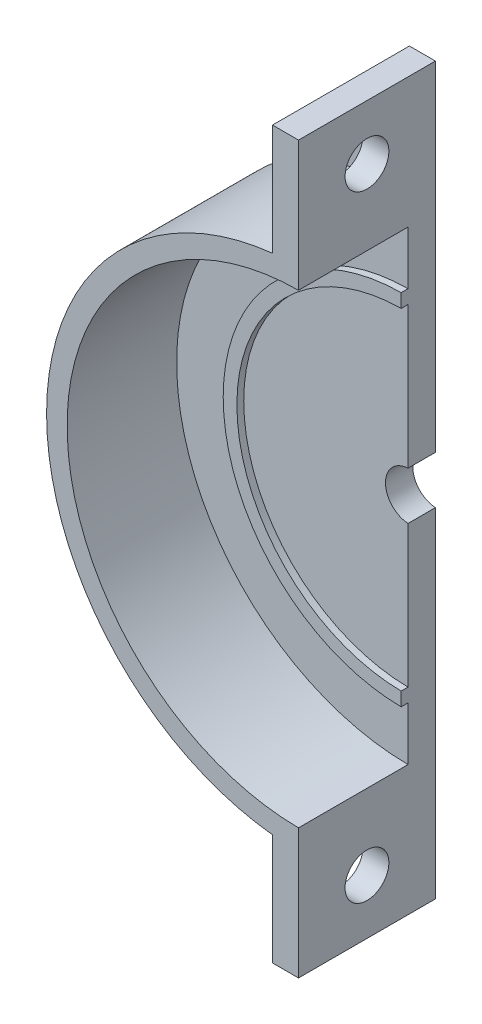
ISO-10303-21;
HEADER;
FILE_DESCRIPTION(('STEP AP214'),'2;1');
FILE_NAME('part.step','',(''),(''),'','','');
FILE_SCHEMA(('AUTOMOTIVE_DESIGN { 1 0 10303 214 1 1 1 1 }'));
ENDSEC;
DATA;
#1=APPLICATION_CONTEXT('core data for automotive mechanical design processes');
#2=APPLICATION_PROTOCOL_DEFINITION('international standard','automotive_design',2000,#1);
#3=PRODUCT_CONTEXT('',#1,'mechanical');
#4=PRODUCT('Part','Part','',(#3));
#5=PRODUCT_RELATED_PRODUCT_CATEGORY('part','',(#4));
#6=PRODUCT_DEFINITION_FORMATION('','',#4);
#7=PRODUCT_DEFINITION_CONTEXT('part definition',#1,'design');
#8=PRODUCT_DEFINITION('design','',#6,#7);
#9=PRODUCT_DEFINITION_SHAPE('','',#8);
#10=(LENGTH_UNIT() NAMED_UNIT(*) SI_UNIT(.MILLI.,.METRE.));
#11=(NAMED_UNIT(*) PLANE_ANGLE_UNIT() SI_UNIT($,.RADIAN.));
#12=(NAMED_UNIT(*) SI_UNIT($,.STERADIAN.) SOLID_ANGLE_UNIT());
#13=UNCERTAINTY_MEASURE_WITH_UNIT(LENGTH_MEASURE(1.E-05),#10,'distance_accuracy_value','');
#14=(GEOMETRIC_REPRESENTATION_CONTEXT(3) GLOBAL_UNCERTAINTY_ASSIGNED_CONTEXT((#13)) GLOBAL_UNIT_ASSIGNED_CONTEXT((#10,
#11,#12)) REPRESENTATION_CONTEXT('',''));
#15=CARTESIAN_POINT('',(0.,0.,0.));
#16=DIRECTION('',(0.,0.,1.));
#17=DIRECTION('',(1.,0.,0.));
#18=AXIS2_PLACEMENT_3D('',#15,#16,#17);
#19=CARTESIAN_POINT('',(0.,0.,2.));
#20=DIRECTION('',(0.,0.,1.));
#21=DIRECTION('',(1.,0.,0.));
#22=AXIS2_PLACEMENT_3D('',#19,#20,#21);
#23=PLANE('',#22);
#24=DIRECTION('',(0.,1.,0.));
#25=VECTOR('',#24,1.);
#26=CARTESIAN_POINT('',(-0.0999999999999977,-1.65,2.));
#27=LINE('',#26,#25);
#28=CARTESIAN_POINT('',(-0.0999999999999952,-16.9997058798086,2.));
#29=VERTEX_POINT('',#28);
#30=CARTESIAN_POINT('',(-0.0999999999999959,-13.0996183150503,2.));
#31=VERTEX_POINT('',#30);
#32=EDGE_CURVE('E63',#29,#31,#27,.T.);
#33=ORIENTED_EDGE('',*,*,#32,.T.);
#34=CARTESIAN_POINT('',(0.,0.,2.));
#35=DIRECTION('',(0.,0.,1.));
#36=DIRECTION('',(1.,0.,0.));
#37=AXIS2_PLACEMENT_3D('',#34,#35,#36);
#38=CIRCLE('',#37,13.1);
#39=CARTESIAN_POINT('',(-0.0999999999999959,13.0996183150503,2.));
#40=VERTEX_POINT('',#39);
#41=EDGE_CURVE('E181',#40,#31,#38,.T.);
#42=ORIENTED_EDGE('',*,*,#41,.F.);
#43=DIRECTION('',(0.,1.,0.));
#44=VECTOR('',#43,1.);
#45=CARTESIAN_POINT('',(-0.0999999999999952,17.,2.));
#46=LINE('',#45,#44);
#47=CARTESIAN_POINT('',(-0.0999999999999952,16.9997058798086,2.));
#48=VERTEX_POINT('',#47);
#49=EDGE_CURVE('E285',#40,#48,#46,.T.);
#50=ORIENTED_EDGE('',*,*,#49,.T.);
#51=CARTESIAN_POINT('',(0.,0.,2.));
#52=DIRECTION('',(0.,0.,1.));
#53=DIRECTION('',(1.,0.,0.));
#54=AXIS2_PLACEMENT_3D('',#51,#52,#53);
#55=CIRCLE('',#54,17.);
#56=EDGE_CURVE('E258',#48,#29,#55,.T.);
#57=ORIENTED_EDGE('',*,*,#56,.T.);
#58=EDGE_LOOP('',(#33,#42,#50,#57));
#59=FACE_BOUND('',#58,.T.);
#60=ADVANCED_FACE('F38',(#59),#23,.T.);
#61=CARTESIAN_POINT('',(-0.0999999999999977,1.74714052096562,2.));
#62=VERTEX_POINT('',#61);
#63=CARTESIAN_POINT('',(-0.099999999999996,12.0995867698033,2.));
#64=VERTEX_POINT('',#63);
#65=EDGE_CURVE('E261',#62,#64,#46,.T.);
#66=ORIENTED_EDGE('',*,*,#65,.T.);
#67=CARTESIAN_POINT('',(0.,0.,2.));
#68=DIRECTION('',(0.,0.,-1.));
#69=DIRECTION('',(1.,0.,0.));
#70=AXIS2_PLACEMENT_3D('',#67,#68,#69);
#71=CIRCLE('',#70,12.1);
#72=CARTESIAN_POINT('',(-0.099999999999996,-12.0995867698033,2.));
#73=VERTEX_POINT('',#72);
#74=EDGE_CURVE('E55',#73,#64,#71,.T.);
#75=ORIENTED_EDGE('',*,*,#74,.F.);
#76=CARTESIAN_POINT('',(-0.0999999999999977,-1.74714052096562,2.));
#77=VERTEX_POINT('',#76);
#78=EDGE_CURVE('E260',#73,#77,#27,.T.);
#79=ORIENTED_EDGE('',*,*,#78,.T.);
#80=CARTESIAN_POINT('',(0.,0.,2.));
#81=DIRECTION('',(0.,0.,1.));
#82=DIRECTION('',(1.,0.,0.));
#83=AXIS2_PLACEMENT_3D('',#80,#81,#82);
#84=CIRCLE('',#83,1.75);
#85=EDGE_CURVE('E275',#77,#62,#84,.F.);
#86=ORIENTED_EDGE('',*,*,#85,.T.);
#87=EDGE_LOOP('',(#66,#75,#79,#86));
#88=FACE_BOUND('',#87,.T.);
#89=ADVANCED_FACE('F311',(#88),#23,.T.);
#90=CARTESIAN_POINT('',(0.,0.,10.));
#91=DIRECTION('',(0.,0.,-1.));
#92=DIRECTION('',(-1.,0.,0.));
#93=AXIS2_PLACEMENT_3D('',#90,#91,#92);
#94=CYLINDRICAL_SURFACE('',#93,18.5);
#95=DIRECTION('',(0.,0.,-1.));
#96=VECTOR('',#95,1.);
#97=CARTESIAN_POINT('',(-6.88958672316867,17.1692630821459,1.));
#98=LINE('',#97,#96);
#99=CARTESIAN_POINT('',(-6.88958672316867,17.1692630821459,1.));
#100=VERTEX_POINT('',#99);
#101=CARTESIAN_POINT('',(-6.88958672316867,17.1692630821459,0.));
#102=VERTEX_POINT('',#101);
#103=EDGE_CURVE('E193',#100,#102,#98,.T.);
#104=ORIENTED_EDGE('',*,*,#103,.T.);
#105=CARTESIAN_POINT('',(0.,0.,0.));
#106=DIRECTION('',(0.,0.,1.));
#107=DIRECTION('',(-1.,0.,0.));
#108=AXIS2_PLACEMENT_3D('',#105,#106,#107);
#109=CIRCLE('',#108,18.5);
#110=CARTESIAN_POINT('',(-6.88958672316868,-17.1692630821459,0.));
#111=VERTEX_POINT('',#110);
#112=EDGE_CURVE('E250',#102,#111,#109,.T.);
#113=ORIENTED_EDGE('',*,*,#112,.T.);
#114=DIRECTION('',(0.,0.,-1.));
#115=VECTOR('',#114,1.);
#116=CARTESIAN_POINT('',(-6.88958672316867,-17.1692630821459,1.));
#117=LINE('',#116,#115);
#118=CARTESIAN_POINT('',(-6.88958672316868,-17.1692630821459,0.999999999999999));
#119=VERTEX_POINT('',#118);
#120=EDGE_CURVE('E224',#119,#111,#117,.T.);
#121=ORIENTED_EDGE('',*,*,#120,.F.);
#122=CARTESIAN_POINT('',(0.,0.,0.999999999999999));
#123=DIRECTION('',(0.,0.,1.));
#124=DIRECTION('',(1.,0.,0.));
#125=AXIS2_PLACEMENT_3D('',#122,#123,#124);
#126=CIRCLE('',#125,18.5);
#127=CARTESIAN_POINT('',(-2.,-18.3915741577495,0.999999999999999));
#128=VERTEX_POINT('',#127);
#129=EDGE_CURVE('E229',#119,#128,#126,.T.);
#130=ORIENTED_EDGE('',*,*,#129,.T.);
#131=DIRECTION('',(0.,0.,-1.));
#132=VECTOR('',#131,1.);
#133=CARTESIAN_POINT('',(-2.,-18.3915741577495,10.));
#134=LINE('',#133,#132);
#135=CARTESIAN_POINT('',(-2.,-18.3915741577495,10.));
#136=VERTEX_POINT('',#135);
#137=EDGE_CURVE('E247',#128,#136,#134,.F.);
#138=ORIENTED_EDGE('',*,*,#137,.T.);
#139=CARTESIAN_POINT('',(0.,0.,10.));
#140=DIRECTION('',(0.,0.,1.));
#141=DIRECTION('',(-1.,0.,0.));
#142=AXIS2_PLACEMENT_3D('',#139,#140,#141);
#143=CIRCLE('',#142,18.5);
#144=CARTESIAN_POINT('',(-2.,18.3915741577495,10.));
#145=VERTEX_POINT('',#144);
#146=EDGE_CURVE('E251',#145,#136,#143,.T.);
#147=ORIENTED_EDGE('',*,*,#146,.F.);
#148=DIRECTION('',(0.,0.,-1.));
#149=VECTOR('',#148,1.);
#150=CARTESIAN_POINT('',(-2.,18.3915741577495,10.));
#151=LINE('',#150,#149);
#152=CARTESIAN_POINT('',(-2.,18.3915741577495,1.));
#153=VERTEX_POINT('',#152);
#154=EDGE_CURVE('E214',#153,#145,#151,.F.);
#155=ORIENTED_EDGE('',*,*,#154,.F.);
#156=CARTESIAN_POINT('',(0.,0.,0.999999999999999));
#157=DIRECTION('',(0.,0.,1.));
#158=DIRECTION('',(1.,0.,0.));
#159=AXIS2_PLACEMENT_3D('',#156,#157,#158);
#160=CIRCLE('',#159,18.5);
#161=EDGE_CURVE('E197',#153,#100,#160,.T.);
#162=ORIENTED_EDGE('',*,*,#161,.T.);
#163=EDGE_LOOP('',(#104,#113,#121,#130,#138,#147,#155,#162));
#164=FACE_BOUND('',#163,.T.);
#165=ADVANCED_FACE('F317',(#164),#94,.T.);
#166=CARTESIAN_POINT('',(0.,0.,2.));
#167=DIRECTION('',(0.,0.,-1.));
#168=DIRECTION('',(-1.,0.,0.));
#169=AXIS2_PLACEMENT_3D('',#166,#167,#168);
#170=CYLINDRICAL_SURFACE('',#169,1.75);
#171=CARTESIAN_POINT('',(0.,0.,0.));
#172=DIRECTION('',(0.,0.,1.));
#173=DIRECTION('',(1.,0.,0.));
#174=AXIS2_PLACEMENT_3D('',#171,#172,#173);
#175=CIRCLE('',#174,1.75);
#176=CARTESIAN_POINT('',(-0.0999999999999977,-1.74714052096562,0.));
#177=VERTEX_POINT('',#176);
#178=CARTESIAN_POINT('',(-0.0999999999999977,1.74714052096562,0.));
#179=VERTEX_POINT('',#178);
#180=EDGE_CURVE('E268',#177,#179,#175,.F.);
#181=ORIENTED_EDGE('',*,*,#180,.T.);
#182=DIRECTION('',(0.,0.,-1.));
#183=VECTOR('',#182,1.);
#184=CARTESIAN_POINT('',(-0.0999999999999977,1.74714052096562,2.));
#185=LINE('',#184,#183);
#186=EDGE_CURVE('E12',#62,#179,#185,.T.);
#187=ORIENTED_EDGE('',*,*,#186,.F.);
#188=ORIENTED_EDGE('',*,*,#85,.F.);
#189=DIRECTION('',(0.,0.,-1.));
#190=VECTOR('',#189,1.);
#191=CARTESIAN_POINT('',(-0.0999999999999977,-1.74714052096562,2.));
#192=LINE('',#191,#190);
#193=EDGE_CURVE('E47',#77,#177,#192,.T.);
#194=ORIENTED_EDGE('',*,*,#193,.T.);
#195=EDGE_LOOP('',(#181,#187,#188,#194));
#196=FACE_BOUND('',#195,.T.);
#197=ADVANCED_FACE('F307',(#196),#170,.F.);
#198=CARTESIAN_POINT('',(-0.0999999999999952,17.,2.));
#199=DIRECTION('',(-1.,0.,0.));
#200=DIRECTION('',(0.,-1.,0.));
#201=AXIS2_PLACEMENT_3D('',#198,#199,#200);
#202=PLANE('',#201);
#203=CARTESIAN_POINT('',(-0.0999999999999942,22.5,5.));
#204=DIRECTION('',(-1.,0.,0.));
#205=DIRECTION('',(0.,-1.,0.));
#206=AXIS2_PLACEMENT_3D('',#203,#204,#205);
#207=CIRCLE('',#206,1.6);
#208=CARTESIAN_POINT('',(-0.0999999999999945,20.9,5.));
#209=VERTEX_POINT('',#208);
#210=EDGE_CURVE('E42',#209,#209,#207,.T.);
#211=ORIENTED_EDGE('',*,*,#210,.T.);
#212=EDGE_LOOP('',(#211));
#213=FACE_BOUND('',#212,.T.);
#214=DIRECTION('',(0.,1.,0.));
#215=VECTOR('',#214,1.);
#216=CARTESIAN_POINT('',(-0.0999999999999952,17.,0.));
#217=LINE('',#216,#215);
#218=CARTESIAN_POINT('',(-0.0999999999999937,26.5,0.));
#219=VERTEX_POINT('',#218);
#220=EDGE_CURVE('E271',#179,#219,#217,.T.);
#221=ORIENTED_EDGE('',*,*,#220,.T.);
#222=DIRECTION('',(0.,0.,1.));
#223=VECTOR('',#222,1.);
#224=CARTESIAN_POINT('',(-0.0999999999999937,26.5,2.));
#225=LINE('',#224,#223);
#226=CARTESIAN_POINT('',(-0.0999999999999937,26.5,10.));
#227=VERTEX_POINT('',#226);
#228=EDGE_CURVE('E203',#219,#227,#225,.T.);
#229=ORIENTED_EDGE('',*,*,#228,.T.);
#230=DIRECTION('',(0.,1.,0.));
#231=VECTOR('',#230,1.);
#232=CARTESIAN_POINT('',(-0.099999999999998,0.,10.));
#233=LINE('',#232,#231);
#234=CARTESIAN_POINT('',(-0.0999999999999952,16.9997058798086,10.));
#235=VERTEX_POINT('',#234);
#236=EDGE_CURVE('E256',#235,#227,#233,.T.);
#237=ORIENTED_EDGE('',*,*,#236,.F.);
#238=DIRECTION('',(0.,0.,-1.));
#239=VECTOR('',#238,1.);
#240=CARTESIAN_POINT('',(-0.0999999999999952,16.9997058798086,10.));
#241=LINE('',#240,#239);
#242=EDGE_CURVE('E281',#235,#48,#241,.T.);
#243=ORIENTED_EDGE('',*,*,#242,.T.);
#244=ORIENTED_EDGE('',*,*,#49,.F.);
#245=DIRECTION('',(0.,0.,-1.));
#246=VECTOR('',#245,1.);
#247=CARTESIAN_POINT('',(-0.0999999999999959,13.0996183150503,2.5));
#248=LINE('',#247,#246);
#249=CARTESIAN_POINT('',(-0.0999999999999959,13.0996183150503,2.5));
#250=VERTEX_POINT('',#249);
#251=EDGE_CURVE('E378',#250,#40,#248,.T.);
#252=ORIENTED_EDGE('',*,*,#251,.F.);
#253=DIRECTION('',(0.,1.,0.));
#254=VECTOR('',#253,1.);
#255=CARTESIAN_POINT('',(-0.0999999999999959,13.0996183150503,2.5));
#256=LINE('',#255,#254);
#257=CARTESIAN_POINT('',(-0.0999999999999959,12.0995867698033,2.5));
#258=VERTEX_POINT('',#257);
#259=EDGE_CURVE('E175',#258,#250,#256,.T.);
#260=ORIENTED_EDGE('',*,*,#259,.F.);
#261=DIRECTION('',(0.,0.,-1.));
#262=VECTOR('',#261,1.);
#263=CARTESIAN_POINT('',(-0.0999999999999959,12.0995867698033,2.5));
#264=LINE('',#263,#262);
#265=EDGE_CURVE('E186',#258,#64,#264,.T.);
#266=ORIENTED_EDGE('',*,*,#265,.T.);
#267=ORIENTED_EDGE('',*,*,#65,.F.);
#268=ORIENTED_EDGE('',*,*,#186,.T.);
#269=EDGE_LOOP('',(#221,#229,#237,#243,#244,#252,#260,#266,#267,#268));
#270=FACE_BOUND('',#269,.T.);
#271=ADVANCED_FACE('F40',(#213,#270),#202,.F.);
#272=CARTESIAN_POINT('',(-0.0999999999999977,-1.65,2.));
#273=DIRECTION('',(-1.,0.,0.));
#274=DIRECTION('',(0.,-1.,0.));
#275=AXIS2_PLACEMENT_3D('',#272,#273,#274);
#276=PLANE('',#275);
#277=CARTESIAN_POINT('',(-0.0999999999999942,-22.5,5.));
#278=DIRECTION('',(-1.,0.,0.));
#279=DIRECTION('',(0.,-1.,0.));
#280=AXIS2_PLACEMENT_3D('',#277,#278,#279);
#281=CIRCLE('',#280,1.6);
#282=CARTESIAN_POINT('',(-0.0999999999999939,-24.1,5.));
#283=VERTEX_POINT('',#282);
#284=EDGE_CURVE('E231',#283,#283,#281,.F.);
#285=ORIENTED_EDGE('',*,*,#284,.F.);
#286=EDGE_LOOP('',(#285));
#287=FACE_BOUND('',#286,.T.);
#288=DIRECTION('',(0.,1.,0.));
#289=VECTOR('',#288,1.);
#290=CARTESIAN_POINT('',(-0.0999999999999977,-1.65,0.));
#291=LINE('',#290,#289);
#292=CARTESIAN_POINT('',(-0.0999999999999937,-26.5,0.));
#293=VERTEX_POINT('',#292);
#294=EDGE_CURVE('E273',#293,#177,#291,.T.);
#295=ORIENTED_EDGE('',*,*,#294,.T.);
#296=ORIENTED_EDGE('',*,*,#193,.F.);
#297=ORIENTED_EDGE('',*,*,#78,.F.);
#298=DIRECTION('',(0.,0.,-1.));
#299=VECTOR('',#298,1.);
#300=CARTESIAN_POINT('',(-0.0999999999999996,-12.0995867698033,2.5));
#301=LINE('',#300,#299);
#302=CARTESIAN_POINT('',(-0.0999999999999996,-12.0995867698033,2.5));
#303=VERTEX_POINT('',#302);
#304=EDGE_CURVE('E166',#303,#73,#301,.T.);
#305=ORIENTED_EDGE('',*,*,#304,.F.);
#306=DIRECTION('',(0.,1.,0.));
#307=VECTOR('',#306,1.);
#308=CARTESIAN_POINT('',(-0.0999999999999959,-12.0995867698033,2.5));
#309=LINE('',#308,#307);
#310=CARTESIAN_POINT('',(-0.0999999999999959,-13.0996183150503,2.5));
#311=VERTEX_POINT('',#310);
#312=EDGE_CURVE('E159',#311,#303,#309,.T.);
#313=ORIENTED_EDGE('',*,*,#312,.F.);
#314=DIRECTION('',(0.,0.,-1.));
#315=VECTOR('',#314,1.);
#316=CARTESIAN_POINT('',(-0.0999999999999959,-13.0996183150503,2.5));
#317=LINE('',#316,#315);
#318=EDGE_CURVE('E163',#311,#31,#317,.T.);
#319=ORIENTED_EDGE('',*,*,#318,.T.);
#320=ORIENTED_EDGE('',*,*,#32,.F.);
#321=DIRECTION('',(0.,0.,-1.));
#322=VECTOR('',#321,1.);
#323=CARTESIAN_POINT('',(-0.0999999999999952,-16.9997058798086,10.));
#324=LINE('',#323,#322);
#325=CARTESIAN_POINT('',(-0.0999999999999952,-16.9997058798086,10.));
#326=VERTEX_POINT('',#325);
#327=EDGE_CURVE('E272',#326,#29,#324,.T.);
#328=ORIENTED_EDGE('',*,*,#327,.F.);
#329=DIRECTION('',(0.,1.,0.));
#330=VECTOR('',#329,1.);
#331=CARTESIAN_POINT('',(-0.099999999999998,0.,10.));
#332=LINE('',#331,#330);
#333=CARTESIAN_POINT('',(-0.0999999999999937,-26.5,10.));
#334=VERTEX_POINT('',#333);
#335=EDGE_CURVE('E253',#334,#326,#332,.T.);
#336=ORIENTED_EDGE('',*,*,#335,.F.);
#337=DIRECTION('',(0.,0.,1.));
#338=VECTOR('',#337,1.);
#339=CARTESIAN_POINT('',(-0.0999999999999937,-26.5,2.));
#340=LINE('',#339,#338);
#341=EDGE_CURVE('E246',#293,#334,#340,.T.);
#342=ORIENTED_EDGE('',*,*,#341,.F.);
#343=EDGE_LOOP('',(#295,#296,#297,#305,#313,#319,#320,#328,#336,#342));
#344=FACE_BOUND('',#343,.T.);
#345=ADVANCED_FACE('F161',(#287,#344),#276,.F.);
#346=CARTESIAN_POINT('',(0.,0.,0.));
#347=DIRECTION('',(0.,0.,1.));
#348=DIRECTION('',(1.,0.,0.));
#349=AXIS2_PLACEMENT_3D('',#346,#347,#348);
#350=PLANE('',#349);
#351=ORIENTED_EDGE('',*,*,#112,.F.);
#352=DIRECTION('',(-0.464160277863083,-0.8857512271818,0.));
#353=VECTOR('',#352,1.);
#354=CARTESIAN_POINT('',(-2.,26.5,0.));
#355=LINE('',#354,#353);
#356=CARTESIAN_POINT('',(-2.,26.5,0.));
#357=VERTEX_POINT('',#356);
#358=EDGE_CURVE('E182',#357,#102,#355,.T.);
#359=ORIENTED_EDGE('',*,*,#358,.F.);
#360=DIRECTION('',(1.,0.,0.));
#361=VECTOR('',#360,1.);
#362=CARTESIAN_POINT('',(0.,26.5,0.));
#363=LINE('',#362,#361);
#364=EDGE_CURVE('E200',#357,#219,#363,.T.);
#365=ORIENTED_EDGE('',*,*,#364,.T.);
#366=ORIENTED_EDGE('',*,*,#220,.F.);
#367=ORIENTED_EDGE('',*,*,#180,.F.);
#368=ORIENTED_EDGE('',*,*,#294,.F.);
#369=DIRECTION('',(1.,0.,0.));
#370=VECTOR('',#369,1.);
#371=CARTESIAN_POINT('',(0.,-26.5,0.));
#372=LINE('',#371,#370);
#373=CARTESIAN_POINT('',(-2.,-26.5,0.));
#374=VERTEX_POINT('',#373);
#375=EDGE_CURVE('E232',#374,#293,#372,.T.);
#376=ORIENTED_EDGE('',*,*,#375,.F.);
#377=DIRECTION('',(-0.464160277863083,0.8857512271818,0.));
#378=VECTOR('',#377,1.);
#379=CARTESIAN_POINT('',(-2.,-26.5,0.));
#380=LINE('',#379,#378);
#381=EDGE_CURVE('E217',#374,#111,#380,.T.);
#382=ORIENTED_EDGE('',*,*,#381,.T.);
#383=EDGE_LOOP('',(#351,#359,#365,#366,#367,#368,#376,#382));
#384=FACE_BOUND('',#383,.T.);
#385=ADVANCED_FACE('F298',(#384),#350,.F.);
#386=CARTESIAN_POINT('',(0.,0.,10.));
#387=DIRECTION('',(0.,0.,-1.));
#388=DIRECTION('',(-1.,0.,0.));
#389=AXIS2_PLACEMENT_3D('',#386,#387,#388);
#390=CYLINDRICAL_SURFACE('',#389,17.);
#391=ORIENTED_EDGE('',*,*,#56,.F.);
#392=ORIENTED_EDGE('',*,*,#242,.F.);
#393=CARTESIAN_POINT('',(0.,0.,10.));
#394=DIRECTION('',(0.,0.,-1.));
#395=DIRECTION('',(-1.,0.,0.));
#396=AXIS2_PLACEMENT_3D('',#393,#394,#395);
#397=CIRCLE('',#396,17.);
#398=EDGE_CURVE('E254',#326,#235,#397,.T.);
#399=ORIENTED_EDGE('',*,*,#398,.F.);
#400=ORIENTED_EDGE('',*,*,#327,.T.);
#401=EDGE_LOOP('',(#391,#392,#399,#400));
#402=FACE_BOUND('',#401,.T.);
#403=ADVANCED_FACE('F304',(#402),#390,.F.);
#404=CARTESIAN_POINT('',(0.,0.,10.));
#405=DIRECTION('',(0.,0.,-1.));
#406=DIRECTION('',(-1.,0.,0.));
#407=AXIS2_PLACEMENT_3D('',#404,#405,#406);
#408=PLANE('',#407);
#409=ORIENTED_EDGE('',*,*,#236,.T.);
#410=DIRECTION('',(1.,0.,0.));
#411=VECTOR('',#410,1.);
#412=CARTESIAN_POINT('',(0.,26.5,10.));
#413=LINE('',#412,#411);
#414=CARTESIAN_POINT('',(-2.,26.5,10.));
#415=VERTEX_POINT('',#414);
#416=EDGE_CURVE('E205',#415,#227,#413,.T.);
#417=ORIENTED_EDGE('',*,*,#416,.F.);
#418=DIRECTION('',(0.,1.,0.));
#419=VECTOR('',#418,1.);
#420=CARTESIAN_POINT('',(-2.,17.3738390090042,10.));
#421=LINE('',#420,#419);
#422=EDGE_CURVE('E204',#145,#415,#421,.T.);
#423=ORIENTED_EDGE('',*,*,#422,.F.);
#424=ORIENTED_EDGE('',*,*,#146,.T.);
#425=DIRECTION('',(0.,-1.,0.));
#426=VECTOR('',#425,1.);
#427=CARTESIAN_POINT('',(-2.,-22.4999931394231,10.));
#428=LINE('',#427,#426);
#429=CARTESIAN_POINT('',(-2.,-26.5,10.));
#430=VERTEX_POINT('',#429);
#431=EDGE_CURVE('E237',#136,#430,#428,.T.);
#432=ORIENTED_EDGE('',*,*,#431,.T.);
#433=DIRECTION('',(1.,0.,0.));
#434=VECTOR('',#433,1.);
#435=CARTESIAN_POINT('',(0.,-26.5,10.));
#436=LINE('',#435,#434);
#437=EDGE_CURVE('E236',#430,#334,#436,.T.);
#438=ORIENTED_EDGE('',*,*,#437,.T.);
#439=ORIENTED_EDGE('',*,*,#335,.T.);
#440=ORIENTED_EDGE('',*,*,#398,.T.);
#441=EDGE_LOOP('',(#409,#417,#423,#424,#432,#438,#439,#440));
#442=FACE_BOUND('',#441,.T.);
#443=ADVANCED_FACE('F359',(#442),#408,.F.);
#444=CARTESIAN_POINT('',(-2.,-22.4999931394231,0.));
#445=DIRECTION('',(-1.,0.,0.));
#446=DIRECTION('',(0.,-1.,0.));
#447=AXIS2_PLACEMENT_3D('',#444,#445,#446);
#448=PLANE('',#447);
#449=DIRECTION('',(0.,-1.,0.));
#450=VECTOR('',#449,1.);
#451=CARTESIAN_POINT('',(-2.,-17.1692630821459,1.));
#452=LINE('',#451,#450);
#453=CARTESIAN_POINT('',(-2.,-26.5,1.));
#454=VERTEX_POINT('',#453);
#455=EDGE_CURVE('E218',#128,#454,#452,.T.);
#456=ORIENTED_EDGE('',*,*,#455,.T.);
#457=DIRECTION('',(0.,0.,1.));
#458=VECTOR('',#457,1.);
#459=CARTESIAN_POINT('',(-2.,-26.5,0.));
#460=LINE('',#459,#458);
#461=EDGE_CURVE('E235',#454,#430,#460,.T.);
#462=ORIENTED_EDGE('',*,*,#461,.T.);
#463=ORIENTED_EDGE('',*,*,#431,.F.);
#464=ORIENTED_EDGE('',*,*,#137,.F.);
#465=EDGE_LOOP('',(#456,#462,#463,#464));
#466=FACE_BOUND('',#465,.T.);
#467=CARTESIAN_POINT('',(-2.,-22.5,5.));
#468=DIRECTION('',(-1.,0.,0.));
#469=DIRECTION('',(0.,-1.,0.));
#470=AXIS2_PLACEMENT_3D('',#467,#468,#469);
#471=CIRCLE('',#470,1.6);
#472=CARTESIAN_POINT('',(-2.,-24.1,5.));
#473=VERTEX_POINT('',#472);
#474=EDGE_CURVE('E240',#473,#473,#471,.T.);
#475=ORIENTED_EDGE('',*,*,#474,.F.);
#476=EDGE_LOOP('',(#475));
#477=FACE_BOUND('',#476,.T.);
#478=ADVANCED_FACE('F352',(#466,#477),#448,.T.);
#479=CARTESIAN_POINT('',(0.,-26.5,0.));
#480=DIRECTION('',(0.,-1.,0.));
#481=DIRECTION('',(0.,0.,-1.));
#482=AXIS2_PLACEMENT_3D('',#479,#480,#481);
#483=PLANE('',#482);
#484=ORIENTED_EDGE('',*,*,#437,.F.);
#485=ORIENTED_EDGE('',*,*,#461,.F.);
#486=EDGE_CURVE('E243',#374,#454,#460,.T.);
#487=ORIENTED_EDGE('',*,*,#486,.F.);
#488=ORIENTED_EDGE('',*,*,#375,.T.);
#489=ORIENTED_EDGE('',*,*,#341,.T.);
#490=EDGE_LOOP('',(#484,#485,#487,#488,#489));
#491=FACE_BOUND('',#490,.T.);
#492=ADVANCED_FACE('F341',(#491),#483,.T.);
#493=CARTESIAN_POINT('',(-9.99999999999999,-22.5,5.));
#494=DIRECTION('',(1.,0.,0.));
#495=DIRECTION('',(0.,1.,0.));
#496=AXIS2_PLACEMENT_3D('',#493,#494,#495);
#497=CYLINDRICAL_SURFACE('',#496,1.6);
#498=ORIENTED_EDGE('',*,*,#474,.T.);
#499=EDGE_LOOP('',(#498));
#500=FACE_BOUND('',#499,.T.);
#501=ORIENTED_EDGE('',*,*,#284,.T.);
#502=EDGE_LOOP('',(#501));
#503=FACE_BOUND('',#502,.T.);
#504=ADVANCED_FACE('F295',(#500,#503),#497,.F.);
#505=CARTESIAN_POINT('',(0.,0.,1.));
#506=DIRECTION('',(0.,0.,1.));
#507=DIRECTION('',(1.,0.,0.));
#508=AXIS2_PLACEMENT_3D('',#505,#506,#507);
#509=PLANE('',#508);
#510=ORIENTED_EDGE('',*,*,#129,.F.);
#511=DIRECTION('',(-0.464160277863083,0.8857512271818,0.));
#512=VECTOR('',#511,1.);
#513=CARTESIAN_POINT('',(-2.,-26.5,1.));
#514=LINE('',#513,#512);
#515=EDGE_CURVE('E221',#454,#119,#514,.T.);
#516=ORIENTED_EDGE('',*,*,#515,.F.);
#517=ORIENTED_EDGE('',*,*,#455,.F.);
#518=EDGE_LOOP('',(#510,#516,#517));
#519=FACE_BOUND('',#518,.T.);
#520=ADVANCED_FACE('F350',(#519),#509,.T.);
#521=CARTESIAN_POINT('',(-2.,-26.5,1.));
#522=DIRECTION('',(-0.8857512271818,-0.464160277863083,0.));
#523=DIRECTION('',(0.464160277863083,-0.8857512271818,0.));
#524=AXIS2_PLACEMENT_3D('',#521,#522,#523);
#525=PLANE('',#524);
#526=ORIENTED_EDGE('',*,*,#381,.F.);
#527=ORIENTED_EDGE('',*,*,#486,.T.);
#528=ORIENTED_EDGE('',*,*,#515,.T.);
#529=ORIENTED_EDGE('',*,*,#120,.T.);
#530=EDGE_LOOP('',(#526,#527,#528,#529));
#531=FACE_BOUND('',#530,.T.);
#532=ADVANCED_FACE('F344',(#531),#525,.T.);
#533=CARTESIAN_POINT('',(-2.,17.3738390090042,0.));
#534=DIRECTION('',(1.,0.,0.));
#535=DIRECTION('',(0.,0.,-1.));
#536=AXIS2_PLACEMENT_3D('',#533,#534,#535);
#537=PLANE('',#536);
#538=CARTESIAN_POINT('',(-2.,22.5,5.));
#539=DIRECTION('',(1.,0.,0.));
#540=DIRECTION('',(0.,0.,-1.));
#541=AXIS2_PLACEMENT_3D('',#538,#539,#540);
#542=CIRCLE('',#541,1.6);
#543=CARTESIAN_POINT('',(-2.,22.5,3.4));
#544=VERTEX_POINT('',#543);
#545=EDGE_CURVE('E208',#544,#544,#542,.F.);
#546=ORIENTED_EDGE('',*,*,#545,.F.);
#547=EDGE_LOOP('',(#546));
#548=FACE_BOUND('',#547,.T.);
#549=DIRECTION('',(0.,0.,1.));
#550=VECTOR('',#549,1.);
#551=CARTESIAN_POINT('',(-2.,26.5,0.));
#552=LINE('',#551,#550);
#553=CARTESIAN_POINT('',(-2.,26.5,1.));
#554=VERTEX_POINT('',#553);
#555=EDGE_CURVE('E215',#554,#415,#552,.T.);
#556=ORIENTED_EDGE('',*,*,#555,.F.);
#557=DIRECTION('',(0.,1.,0.));
#558=VECTOR('',#557,1.);
#559=CARTESIAN_POINT('',(-2.,17.1692630821459,1.));
#560=LINE('',#559,#558);
#561=EDGE_CURVE('E184',#153,#554,#560,.T.);
#562=ORIENTED_EDGE('',*,*,#561,.F.);
#563=ORIENTED_EDGE('',*,*,#154,.T.);
#564=ORIENTED_EDGE('',*,*,#422,.T.);
#565=EDGE_LOOP('',(#556,#562,#563,#564));
#566=FACE_BOUND('',#565,.T.);
#567=ADVANCED_FACE('F363',(#548,#566),#537,.F.);
#568=CARTESIAN_POINT('',(0.,26.5,0.));
#569=DIRECTION('',(0.,-1.,0.));
#570=DIRECTION('',(0.,0.,-1.));
#571=AXIS2_PLACEMENT_3D('',#568,#569,#570);
#572=PLANE('',#571);
#573=ORIENTED_EDGE('',*,*,#416,.T.);
#574=ORIENTED_EDGE('',*,*,#228,.F.);
#575=ORIENTED_EDGE('',*,*,#364,.F.);
#576=EDGE_CURVE('E211',#357,#554,#552,.T.);
#577=ORIENTED_EDGE('',*,*,#576,.T.);
#578=ORIENTED_EDGE('',*,*,#555,.T.);
#579=EDGE_LOOP('',(#573,#574,#575,#577,#578));
#580=FACE_BOUND('',#579,.T.);
#581=ADVANCED_FACE('F372',(#580),#572,.F.);
#582=CARTESIAN_POINT('',(-9.99999999999999,22.5,5.));
#583=DIRECTION('',(1.,0.,0.));
#584=DIRECTION('',(0.,1.,0.));
#585=AXIS2_PLACEMENT_3D('',#582,#583,#584);
#586=CYLINDRICAL_SURFACE('',#585,1.6);
#587=ORIENTED_EDGE('',*,*,#210,.F.);
#588=EDGE_LOOP('',(#587));
#589=FACE_BOUND('',#588,.T.);
#590=ORIENTED_EDGE('',*,*,#545,.T.);
#591=EDGE_LOOP('',(#590));
#592=FACE_BOUND('',#591,.T.);
#593=ADVANCED_FACE('F396',(#589,#592),#586,.F.);
#594=CARTESIAN_POINT('',(0.,0.,1.));
#595=DIRECTION('',(0.,0.,1.));
#596=DIRECTION('',(1.,0.,0.));
#597=AXIS2_PLACEMENT_3D('',#594,#595,#596);
#598=PLANE('',#597);
#599=ORIENTED_EDGE('',*,*,#161,.F.);
#600=ORIENTED_EDGE('',*,*,#561,.T.);
#601=DIRECTION('',(-0.464160277863083,-0.8857512271818,0.));
#602=VECTOR('',#601,1.);
#603=CARTESIAN_POINT('',(-2.,26.5,1.));
#604=LINE('',#603,#602);
#605=EDGE_CURVE('E192',#554,#100,#604,.T.);
#606=ORIENTED_EDGE('',*,*,#605,.T.);
#607=EDGE_LOOP('',(#599,#600,#606));
#608=FACE_BOUND('',#607,.T.);
#609=ADVANCED_FACE('F366',(#608),#598,.T.);
#610=CARTESIAN_POINT('',(-2.,26.5,1.));
#611=DIRECTION('',(0.8857512271818,-0.464160277863083,0.));
#612=DIRECTION('',(0.464160277863083,0.8857512271818,0.));
#613=AXIS2_PLACEMENT_3D('',#610,#611,#612);
#614=PLANE('',#613);
#615=ORIENTED_EDGE('',*,*,#358,.T.);
#616=ORIENTED_EDGE('',*,*,#103,.F.);
#617=ORIENTED_EDGE('',*,*,#605,.F.);
#618=ORIENTED_EDGE('',*,*,#576,.F.);
#619=EDGE_LOOP('',(#615,#616,#617,#618));
#620=FACE_BOUND('',#619,.T.);
#621=ADVANCED_FACE('F370',(#620),#614,.F.);
#622=CARTESIAN_POINT('',(0.,0.,2.5));
#623=DIRECTION('',(0.,0.,-1.));
#624=DIRECTION('',(-1.,0.,0.));
#625=AXIS2_PLACEMENT_3D('',#622,#623,#624);
#626=CYLINDRICAL_SURFACE('',#625,13.1);
#627=ORIENTED_EDGE('',*,*,#41,.T.);
#628=ORIENTED_EDGE('',*,*,#318,.F.);
#629=CARTESIAN_POINT('',(0.,0.,2.5));
#630=DIRECTION('',(0.,0.,1.));
#631=DIRECTION('',(1.,0.,0.));
#632=AXIS2_PLACEMENT_3D('',#629,#630,#631);
#633=CIRCLE('',#632,13.1);
#634=EDGE_CURVE('E170',#250,#311,#633,.T.);
#635=ORIENTED_EDGE('',*,*,#634,.F.);
#636=ORIENTED_EDGE('',*,*,#251,.T.);
#637=EDGE_LOOP('',(#627,#628,#635,#636));
#638=FACE_BOUND('',#637,.T.);
#639=ADVANCED_FACE('F180',(#638),#626,.T.);
#640=CARTESIAN_POINT('',(0.,0.,2.5));
#641=DIRECTION('',(0.,0.,-1.));
#642=DIRECTION('',(-1.,0.,0.));
#643=AXIS2_PLACEMENT_3D('',#640,#641,#642);
#644=CYLINDRICAL_SURFACE('',#643,12.1);
#645=ORIENTED_EDGE('',*,*,#74,.T.);
#646=ORIENTED_EDGE('',*,*,#265,.F.);
#647=CARTESIAN_POINT('',(0.,0.,2.5));
#648=DIRECTION('',(0.,0.,-1.));
#649=DIRECTION('',(1.,0.,0.));
#650=AXIS2_PLACEMENT_3D('',#647,#648,#649);
#651=CIRCLE('',#650,12.1);
#652=EDGE_CURVE('E169',#303,#258,#651,.T.);
#653=ORIENTED_EDGE('',*,*,#652,.F.);
#654=ORIENTED_EDGE('',*,*,#304,.T.);
#655=EDGE_LOOP('',(#645,#646,#653,#654));
#656=FACE_BOUND('',#655,.T.);
#657=ADVANCED_FACE('F385',(#656),#644,.F.);
#658=CARTESIAN_POINT('',(0.,0.,2.5));
#659=DIRECTION('',(0.,0.,1.));
#660=DIRECTION('',(1.,0.,0.));
#661=AXIS2_PLACEMENT_3D('',#658,#659,#660);
#662=PLANE('',#661);
#663=ORIENTED_EDGE('',*,*,#634,.T.);
#664=ORIENTED_EDGE('',*,*,#312,.T.);
#665=ORIENTED_EDGE('',*,*,#652,.T.);
#666=ORIENTED_EDGE('',*,*,#259,.T.);
#667=EDGE_LOOP('',(#663,#664,#665,#666));
#668=FACE_BOUND('',#667,.T.);
#669=ADVANCED_FACE('F173',(#668),#662,.T.);
#670=CLOSED_SHELL('',(#60,#89,#165,#197,#271,#345,#385,#403,#443,#478,#492,#504,#520,#532,#567,
#581,#593,#609,#621,#639,#657,#669));
#671=MANIFOLD_SOLID_BREP('B2',#670);
#672=ADVANCED_BREP_SHAPE_REPRESENTATION('',(#18,#671),#14);
#673=SHAPE_DEFINITION_REPRESENTATION(#9,#672);
ENDSEC;
END-ISO-10303-21;
